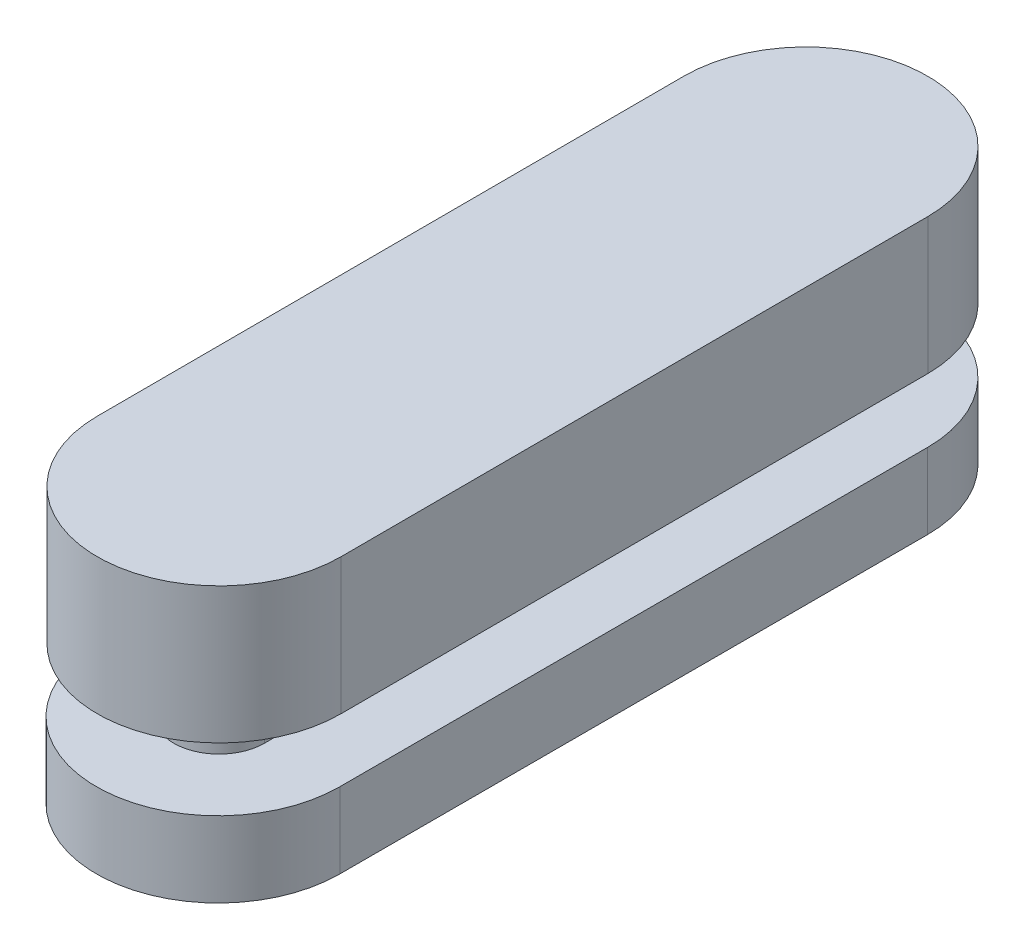
ISO-10303-21;
HEADER;
FILE_DESCRIPTION(('STEP AP214'),'2;1');
FILE_NAME('part.step','',(''),(''),'','','');
FILE_SCHEMA(('AUTOMOTIVE_DESIGN { 1 0 10303 214 1 1 1 1 }'));
ENDSEC;
DATA;
#1=APPLICATION_CONTEXT('core data for automotive mechanical design processes');
#2=APPLICATION_PROTOCOL_DEFINITION('international standard','automotive_design',2000,#1);
#3=PRODUCT_CONTEXT('',#1,'mechanical');
#4=PRODUCT('Part','Part','',(#3));
#5=PRODUCT_RELATED_PRODUCT_CATEGORY('part','',(#4));
#6=PRODUCT_DEFINITION_FORMATION('','',#4);
#7=PRODUCT_DEFINITION_CONTEXT('part definition',#1,'design');
#8=PRODUCT_DEFINITION('design','',#6,#7);
#9=PRODUCT_DEFINITION_SHAPE('','',#8);
#10=(LENGTH_UNIT() NAMED_UNIT(*) SI_UNIT(.MILLI.,.METRE.));
#11=(NAMED_UNIT(*) PLANE_ANGLE_UNIT() SI_UNIT($,.RADIAN.));
#12=(NAMED_UNIT(*) SI_UNIT($,.STERADIAN.) SOLID_ANGLE_UNIT());
#13=UNCERTAINTY_MEASURE_WITH_UNIT(LENGTH_MEASURE(1.E-05),#10,'distance_accuracy_value','');
#14=(GEOMETRIC_REPRESENTATION_CONTEXT(3) GLOBAL_UNCERTAINTY_ASSIGNED_CONTEXT((#13)) GLOBAL_UNIT_ASSIGNED_CONTEXT((#10,
#11,#12)) REPRESENTATION_CONTEXT('',''));
#15=CARTESIAN_POINT('',(0.,0.,0.));
#16=DIRECTION('',(0.,0.,1.));
#17=DIRECTION('',(1.,0.,0.));
#18=AXIS2_PLACEMENT_3D('',#15,#16,#17);
#19=CARTESIAN_POINT('',(0.,4.5,0.));
#20=DIRECTION('',(0.,-1.,0.));
#21=DIRECTION('',(0.,0.,-1.));
#22=AXIS2_PLACEMENT_3D('',#19,#20,#21);
#23=CYLINDRICAL_SURFACE('',#22,7.25);
#24=CARTESIAN_POINT('',(0.,0.,0.));
#25=DIRECTION('',(0.,1.,0.));
#26=DIRECTION('',(0.,0.,1.));
#27=AXIS2_PLACEMENT_3D('',#24,#25,#26);
#28=CIRCLE('',#27,7.25);
#29=CARTESIAN_POINT('',(7.25,0.,0.));
#30=VERTEX_POINT('',#29);
#31=CARTESIAN_POINT('',(-7.25,0.,0.));
#32=VERTEX_POINT('',#31);
#33=EDGE_CURVE('E181',#30,#32,#28,.T.);
#34=ORIENTED_EDGE('',*,*,#33,.T.);
#35=DIRECTION('',(0.,-1.,0.));
#36=VECTOR('',#35,1.);
#37=CARTESIAN_POINT('',(-7.25,4.5,0.));
#38=LINE('',#37,#36);
#39=CARTESIAN_POINT('',(-7.25,4.5,0.));
#40=VERTEX_POINT('',#39);
#41=EDGE_CURVE('E11',#40,#32,#38,.T.);
#42=ORIENTED_EDGE('',*,*,#41,.F.);
#43=CARTESIAN_POINT('',(0.,4.5,0.));
#44=DIRECTION('',(0.,1.,0.));
#45=DIRECTION('',(0.,0.,1.));
#46=AXIS2_PLACEMENT_3D('',#43,#44,#45);
#47=CIRCLE('',#46,7.25);
#48=CARTESIAN_POINT('',(7.25,4.5,0.));
#49=VERTEX_POINT('',#48);
#50=EDGE_CURVE('E182',#49,#40,#47,.T.);
#51=ORIENTED_EDGE('',*,*,#50,.F.);
#52=DIRECTION('',(0.,-1.,0.));
#53=VECTOR('',#52,1.);
#54=CARTESIAN_POINT('',(7.25,4.5,0.));
#55=LINE('',#54,#53);
#56=EDGE_CURVE('E192',#49,#30,#55,.T.);
#57=ORIENTED_EDGE('',*,*,#56,.T.);
#58=EDGE_LOOP('',(#34,#42,#51,#57));
#59=FACE_BOUND('',#58,.T.);
#60=ADVANCED_FACE('F37',(#59),#23,.T.);
#61=CARTESIAN_POINT('',(-7.25,4.5,0.));
#62=DIRECTION('',(1.,0.,0.));
#63=DIRECTION('',(0.,0.,-1.));
#64=AXIS2_PLACEMENT_3D('',#61,#62,#63);
#65=PLANE('',#64);
#66=DIRECTION('',(0.,0.,1.));
#67=VECTOR('',#66,1.);
#68=CARTESIAN_POINT('',(-7.25,0.,0.));
#69=LINE('',#68,#67);
#70=CARTESIAN_POINT('',(-7.24999999999999,0.,35.));
#71=VERTEX_POINT('',#70);
#72=EDGE_CURVE('E195',#32,#71,#69,.T.);
#73=ORIENTED_EDGE('',*,*,#72,.T.);
#74=DIRECTION('',(0.,-1.,0.));
#75=VECTOR('',#74,1.);
#76=CARTESIAN_POINT('',(-7.24999999999999,4.5,35.));
#77=LINE('',#76,#75);
#78=CARTESIAN_POINT('',(-7.24999999999999,4.5,35.));
#79=VERTEX_POINT('',#78);
#80=EDGE_CURVE('E44',#79,#71,#77,.T.);
#81=ORIENTED_EDGE('',*,*,#80,.F.);
#82=DIRECTION('',(0.,0.,1.));
#83=VECTOR('',#82,1.);
#84=CARTESIAN_POINT('',(-7.25,4.5,0.));
#85=LINE('',#84,#83);
#86=EDGE_CURVE('E185',#40,#79,#85,.T.);
#87=ORIENTED_EDGE('',*,*,#86,.F.);
#88=ORIENTED_EDGE('',*,*,#41,.T.);
#89=EDGE_LOOP('',(#73,#81,#87,#88));
#90=FACE_BOUND('',#89,.T.);
#91=ADVANCED_FACE('F225',(#90),#65,.F.);
#92=CARTESIAN_POINT('',(0.,4.5,35.));
#93=DIRECTION('',(0.,-1.,0.));
#94=DIRECTION('',(0.,0.,-1.));
#95=AXIS2_PLACEMENT_3D('',#92,#93,#94);
#96=CYLINDRICAL_SURFACE('',#95,7.25);
#97=CARTESIAN_POINT('',(0.,0.,35.));
#98=DIRECTION('',(0.,1.,0.));
#99=DIRECTION('',(0.,0.,1.));
#100=AXIS2_PLACEMENT_3D('',#97,#98,#99);
#101=CIRCLE('',#100,7.25);
#102=CARTESIAN_POINT('',(7.25,0.,35.));
#103=VERTEX_POINT('',#102);
#104=EDGE_CURVE('E197',#71,#103,#101,.T.);
#105=ORIENTED_EDGE('',*,*,#104,.T.);
#106=DIRECTION('',(0.,-1.,0.));
#107=VECTOR('',#106,1.);
#108=CARTESIAN_POINT('',(7.25,4.5,35.));
#109=LINE('',#108,#107);
#110=CARTESIAN_POINT('',(7.25,4.5,35.));
#111=VERTEX_POINT('',#110);
#112=EDGE_CURVE('E202',#111,#103,#109,.T.);
#113=ORIENTED_EDGE('',*,*,#112,.F.);
#114=CARTESIAN_POINT('',(0.,4.5,35.));
#115=DIRECTION('',(0.,1.,0.));
#116=DIRECTION('',(0.,0.,1.));
#117=AXIS2_PLACEMENT_3D('',#114,#115,#116);
#118=CIRCLE('',#117,7.25);
#119=EDGE_CURVE('E188',#79,#111,#118,.T.);
#120=ORIENTED_EDGE('',*,*,#119,.F.);
#121=ORIENTED_EDGE('',*,*,#80,.T.);
#122=EDGE_LOOP('',(#105,#113,#120,#121));
#123=FACE_BOUND('',#122,.T.);
#124=ADVANCED_FACE('F209',(#123),#96,.T.);
#125=CARTESIAN_POINT('',(7.25,4.5,0.));
#126=DIRECTION('',(-1.,0.,0.));
#127=DIRECTION('',(0.,0.,1.));
#128=AXIS2_PLACEMENT_3D('',#125,#126,#127);
#129=PLANE('',#128);
#130=DIRECTION('',(0.,0.,-1.));
#131=VECTOR('',#130,1.);
#132=CARTESIAN_POINT('',(7.25,0.,0.));
#133=LINE('',#132,#131);
#134=EDGE_CURVE('E186',#103,#30,#133,.T.);
#135=ORIENTED_EDGE('',*,*,#134,.T.);
#136=ORIENTED_EDGE('',*,*,#56,.F.);
#137=DIRECTION('',(0.,0.,-1.));
#138=VECTOR('',#137,1.);
#139=CARTESIAN_POINT('',(7.25,4.5,0.));
#140=LINE('',#139,#138);
#141=EDGE_CURVE('E190',#111,#49,#140,.T.);
#142=ORIENTED_EDGE('',*,*,#141,.F.);
#143=ORIENTED_EDGE('',*,*,#112,.T.);
#144=EDGE_LOOP('',(#135,#136,#142,#143));
#145=FACE_BOUND('',#144,.T.);
#146=ADVANCED_FACE('F218',(#145),#129,.F.);
#147=CARTESIAN_POINT('',(0.,4.5,0.));
#148=DIRECTION('',(0.,1.,0.));
#149=DIRECTION('',(0.,0.,1.));
#150=AXIS2_PLACEMENT_3D('',#147,#148,#149);
#151=PLANE('',#150);
#152=CARTESIAN_POINT('',(0.0706103890184494,4.5,0.0112960812225504));
#153=DIRECTION('',(0.,1.,0.));
#154=DIRECTION('',(0.,0.,1.));
#155=AXIS2_PLACEMENT_3D('',#152,#153,#154);
#156=CIRCLE('',#155,2.72992224514324);
#157=CARTESIAN_POINT('',(2.76379226914791,4.5,0.457666807267897));
#158=VERTEX_POINT('',#157);
#159=CARTESIAN_POINT('',(-2.62257149111101,4.5,0.457666807267911));
#160=VERTEX_POINT('',#159);
#161=EDGE_CURVE('E51',#158,#160,#156,.T.);
#162=ORIENTED_EDGE('',*,*,#161,.F.);
#163=DIRECTION('',(0.,0.,1.));
#164=VECTOR('',#163,1.);
#165=CARTESIAN_POINT('',(2.76379226914791,4.5,0.));
#166=LINE('',#165,#164);
#167=CARTESIAN_POINT('',(2.76379226914791,4.5,35.0112960812226));
#168=VERTEX_POINT('',#167);
#169=EDGE_CURVE('E56',#158,#168,#166,.T.);
#170=ORIENTED_EDGE('',*,*,#169,.T.);
#171=CARTESIAN_POINT('',(0.0706103890184538,4.5,35.0112960812226));
#172=DIRECTION('',(0.,1.,0.));
#173=DIRECTION('',(0.,0.,1.));
#174=AXIS2_PLACEMENT_3D('',#171,#172,#173);
#175=CIRCLE('',#174,2.69318188012946);
#176=CARTESIAN_POINT('',(-2.622571491111,4.5,35.0112960812226));
#177=VERTEX_POINT('',#176);
#178=EDGE_CURVE('E168',#177,#168,#175,.T.);
#179=ORIENTED_EDGE('',*,*,#178,.F.);
#180=DIRECTION('',(0.,0.,1.));
#181=VECTOR('',#180,1.);
#182=CARTESIAN_POINT('',(-2.62257149111101,4.5,0.));
#183=LINE('',#182,#181);
#184=EDGE_CURVE('E150',#160,#177,#183,.T.);
#185=ORIENTED_EDGE('',*,*,#184,.F.);
#186=EDGE_LOOP('',(#162,#170,#179,#185));
#187=FACE_BOUND('',#186,.T.);
#188=ORIENTED_EDGE('',*,*,#50,.T.);
#189=ORIENTED_EDGE('',*,*,#86,.T.);
#190=ORIENTED_EDGE('',*,*,#119,.T.);
#191=ORIENTED_EDGE('',*,*,#141,.T.);
#192=EDGE_LOOP('',(#188,#189,#190,#191));
#193=FACE_BOUND('',#192,.T.);
#194=ADVANCED_FACE('F224',(#187,#193),#151,.T.);
#195=CARTESIAN_POINT('',(0.,0.,0.));
#196=DIRECTION('',(0.,1.,0.));
#197=DIRECTION('',(0.,0.,1.));
#198=AXIS2_PLACEMENT_3D('',#195,#196,#197);
#199=PLANE('',#198);
#200=ORIENTED_EDGE('',*,*,#33,.F.);
#201=ORIENTED_EDGE('',*,*,#134,.F.);
#202=ORIENTED_EDGE('',*,*,#104,.F.);
#203=ORIENTED_EDGE('',*,*,#72,.F.);
#204=EDGE_LOOP('',(#200,#201,#202,#203));
#205=FACE_BOUND('',#204,.T.);
#206=ADVANCED_FACE('F215',(#205),#199,.F.);
#207=CARTESIAN_POINT('',(0.0706103890184494,8.3,0.0112960812225504));
#208=DIRECTION('',(0.,-1.,0.));
#209=DIRECTION('',(0.,0.,-1.));
#210=AXIS2_PLACEMENT_3D('',#207,#208,#209);
#211=CYLINDRICAL_SURFACE('',#210,2.72992224514324);
#212=ORIENTED_EDGE('',*,*,#161,.T.);
#213=DIRECTION('',(0.,-1.,0.));
#214=VECTOR('',#213,1.);
#215=CARTESIAN_POINT('',(-2.62257149111101,8.3,0.457666807267911));
#216=LINE('',#215,#214);
#217=CARTESIAN_POINT('',(-2.62257149111101,8.3,0.457666807267911));
#218=VERTEX_POINT('',#217);
#219=EDGE_CURVE('E178',#218,#160,#216,.T.);
#220=ORIENTED_EDGE('',*,*,#219,.F.);
#221=CARTESIAN_POINT('',(0.0706103890184494,8.3,0.0112960812225504));
#222=DIRECTION('',(0.,1.,0.));
#223=DIRECTION('',(0.,0.,1.));
#224=AXIS2_PLACEMENT_3D('',#221,#222,#223);
#225=CIRCLE('',#224,2.72992224514324);
#226=CARTESIAN_POINT('',(2.76379226914791,8.3,0.457666807267897));
#227=VERTEX_POINT('',#226);
#228=EDGE_CURVE('E156',#227,#218,#225,.T.);
#229=ORIENTED_EDGE('',*,*,#228,.F.);
#230=DIRECTION('',(0.,-1.,0.));
#231=VECTOR('',#230,1.);
#232=CARTESIAN_POINT('',(2.76379226914791,8.3,0.457666807267897));
#233=LINE('',#232,#231);
#234=EDGE_CURVE('E164',#227,#158,#233,.T.);
#235=ORIENTED_EDGE('',*,*,#234,.T.);
#236=EDGE_LOOP('',(#212,#220,#229,#235));
#237=FACE_BOUND('',#236,.T.);
#238=ADVANCED_FACE('F237',(#237),#211,.T.);
#239=CARTESIAN_POINT('',(-2.62257149111101,8.3,0.));
#240=DIRECTION('',(1.,0.,0.));
#241=DIRECTION('',(0.,0.,-1.));
#242=AXIS2_PLACEMENT_3D('',#239,#240,#241);
#243=PLANE('',#242);
#244=ORIENTED_EDGE('',*,*,#184,.T.);
#245=DIRECTION('',(0.,-1.,0.));
#246=VECTOR('',#245,1.);
#247=CARTESIAN_POINT('',(-2.622571491111,8.3,35.0112960812226));
#248=LINE('',#247,#246);
#249=CARTESIAN_POINT('',(-2.622571491111,8.3,35.0112960812226));
#250=VERTEX_POINT('',#249);
#251=EDGE_CURVE('E175',#250,#177,#248,.T.);
#252=ORIENTED_EDGE('',*,*,#251,.F.);
#253=DIRECTION('',(0.,0.,1.));
#254=VECTOR('',#253,1.);
#255=CARTESIAN_POINT('',(-2.62257149111101,8.3,0.));
#256=LINE('',#255,#254);
#257=EDGE_CURVE('E158',#218,#250,#256,.T.);
#258=ORIENTED_EDGE('',*,*,#257,.F.);
#259=ORIENTED_EDGE('',*,*,#219,.T.);
#260=EDGE_LOOP('',(#244,#252,#258,#259));
#261=FACE_BOUND('',#260,.T.);
#262=ADVANCED_FACE('F242',(#261),#243,.F.);
#263=CARTESIAN_POINT('',(0.0706103890184538,8.3,35.0112960812226));
#264=DIRECTION('',(0.,-1.,0.));
#265=DIRECTION('',(0.,0.,-1.));
#266=AXIS2_PLACEMENT_3D('',#263,#264,#265);
#267=CYLINDRICAL_SURFACE('',#266,2.69318188012946);
#268=ORIENTED_EDGE('',*,*,#178,.T.);
#269=DIRECTION('',(0.,-1.,0.));
#270=VECTOR('',#269,1.);
#271=CARTESIAN_POINT('',(2.76379226914791,8.3,35.0112960812226));
#272=LINE('',#271,#270);
#273=CARTESIAN_POINT('',(2.76379226914791,8.3,35.0112960812226));
#274=VERTEX_POINT('',#273);
#275=EDGE_CURVE('E173',#274,#168,#272,.T.);
#276=ORIENTED_EDGE('',*,*,#275,.F.);
#277=CARTESIAN_POINT('',(0.0706103890184538,8.3,35.0112960812226));
#278=DIRECTION('',(0.,1.,0.));
#279=DIRECTION('',(0.,0.,1.));
#280=AXIS2_PLACEMENT_3D('',#277,#278,#279);
#281=CIRCLE('',#280,2.69318188012946);
#282=EDGE_CURVE('E160',#250,#274,#281,.T.);
#283=ORIENTED_EDGE('',*,*,#282,.F.);
#284=ORIENTED_EDGE('',*,*,#251,.T.);
#285=EDGE_LOOP('',(#268,#276,#283,#284));
#286=FACE_BOUND('',#285,.T.);
#287=ADVANCED_FACE('F246',(#286),#267,.T.);
#288=CARTESIAN_POINT('',(2.76379226914791,8.3,0.));
#289=DIRECTION('',(1.,0.,0.));
#290=DIRECTION('',(0.,0.,-1.));
#291=AXIS2_PLACEMENT_3D('',#288,#289,#290);
#292=PLANE('',#291);
#293=ORIENTED_EDGE('',*,*,#169,.F.);
#294=ORIENTED_EDGE('',*,*,#234,.F.);
#295=DIRECTION('',(0.,0.,1.));
#296=VECTOR('',#295,1.);
#297=CARTESIAN_POINT('',(2.76379226914791,8.3,0.));
#298=LINE('',#297,#296);
#299=EDGE_CURVE('E162',#227,#274,#298,.T.);
#300=ORIENTED_EDGE('',*,*,#299,.T.);
#301=ORIENTED_EDGE('',*,*,#275,.T.);
#302=EDGE_LOOP('',(#293,#294,#300,#301));
#303=FACE_BOUND('',#302,.T.);
#304=ADVANCED_FACE('F250',(#303),#292,.T.);
#305=CARTESIAN_POINT('',(0.,8.3,0.));
#306=DIRECTION('',(0.,1.,0.));
#307=DIRECTION('',(0.,0.,1.));
#308=AXIS2_PLACEMENT_3D('',#305,#306,#307);
#309=PLANE('',#308);
#310=CARTESIAN_POINT('',(0.,8.3,0.));
#311=DIRECTION('',(0.,1.,0.));
#312=DIRECTION('',(0.,0.,1.));
#313=AXIS2_PLACEMENT_3D('',#310,#311,#312);
#314=CIRCLE('',#313,7.25309616093368);
#315=CARTESIAN_POINT('',(7.25308141022293,8.3,-0.0146279331896265));
#316=VERTEX_POINT('',#315);
#317=CARTESIAN_POINT('',(-7.25308141022293,8.3,0.0146279331896265));
#318=VERTEX_POINT('',#317);
#319=EDGE_CURVE('E148',#316,#318,#314,.T.);
#320=ORIENTED_EDGE('',*,*,#319,.F.);
#321=DIRECTION('',(-0.0020167846758209,0.,-0.999997966287718));
#322=VECTOR('',#321,1.);
#323=CARTESIAN_POINT('',(7.25308141022293,8.3,-0.0146279331896265));
#324=LINE('',#323,#322);
#325=CARTESIAN_POINT('',(7.32369179924138,8.3,34.9966681480329));
#326=VERTEX_POINT('',#325);
#327=EDGE_CURVE('E144',#326,#316,#324,.T.);
#328=ORIENTED_EDGE('',*,*,#327,.F.);
#329=CARTESIAN_POINT('',(0.0706103890184538,8.3,35.0112960812226));
#330=DIRECTION('',(0.,1.,0.));
#331=DIRECTION('',(0.,0.,1.));
#332=AXIS2_PLACEMENT_3D('',#329,#330,#331);
#333=CIRCLE('',#332,7.25309616093368);
#334=CARTESIAN_POINT('',(-7.18247102120448,8.3,35.0259240144122));
#335=VERTEX_POINT('',#334);
#336=EDGE_CURVE('E378',#335,#326,#333,.T.);
#337=ORIENTED_EDGE('',*,*,#336,.F.);
#338=DIRECTION('',(0.0020167846758209,0.,0.999997966287718));
#339=VECTOR('',#338,1.);
#340=CARTESIAN_POINT('',(-7.25308141022293,8.3,0.0146279331896265));
#341=LINE('',#340,#339);
#342=EDGE_CURVE('E376',#318,#335,#341,.T.);
#343=ORIENTED_EDGE('',*,*,#342,.F.);
#344=EDGE_LOOP('',(#320,#328,#337,#343));
#345=FACE_BOUND('',#344,.T.);
#346=ORIENTED_EDGE('',*,*,#299,.F.);
#347=ORIENTED_EDGE('',*,*,#228,.T.);
#348=ORIENTED_EDGE('',*,*,#257,.T.);
#349=ORIENTED_EDGE('',*,*,#282,.T.);
#350=EDGE_LOOP('',(#346,#347,#348,#349));
#351=FACE_BOUND('',#350,.T.);
#352=ADVANCED_FACE('F254',(#345,#351),#309,.F.);
#353=CARTESIAN_POINT('',(0.,16.4,0.));
#354=DIRECTION('',(0.,-1.,0.));
#355=DIRECTION('',(0.,0.,-1.));
#356=AXIS2_PLACEMENT_3D('',#353,#354,#355);
#357=CYLINDRICAL_SURFACE('',#356,7.25309616093368);
#358=ORIENTED_EDGE('',*,*,#319,.T.);
#359=DIRECTION('',(0.,-1.,0.));
#360=VECTOR('',#359,1.);
#361=CARTESIAN_POINT('',(-7.25308141022293,16.4,0.0146279331896265));
#362=LINE('',#361,#360);
#363=CARTESIAN_POINT('',(-7.25308141022293,16.4,0.0146279331896265));
#364=VERTEX_POINT('',#363);
#365=EDGE_CURVE('E128',#364,#318,#362,.T.);
#366=ORIENTED_EDGE('',*,*,#365,.F.);
#367=CARTESIAN_POINT('',(0.,16.4,0.));
#368=DIRECTION('',(0.,1.,0.));
#369=DIRECTION('',(0.,0.,1.));
#370=AXIS2_PLACEMENT_3D('',#367,#368,#369);
#371=CIRCLE('',#370,7.25309616093368);
#372=CARTESIAN_POINT('',(7.25308141022293,16.4,-0.0146279331896265));
#373=VERTEX_POINT('',#372);
#374=EDGE_CURVE('E135',#373,#364,#371,.T.);
#375=ORIENTED_EDGE('',*,*,#374,.F.);
#376=DIRECTION('',(0.,-1.,0.));
#377=VECTOR('',#376,1.);
#378=CARTESIAN_POINT('',(7.25308141022293,16.4,-0.0146279331896265));
#379=LINE('',#378,#377);
#380=EDGE_CURVE('E385',#373,#316,#379,.T.);
#381=ORIENTED_EDGE('',*,*,#380,.T.);
#382=EDGE_LOOP('',(#358,#366,#375,#381));
#383=FACE_BOUND('',#382,.T.);
#384=ADVANCED_FACE('F146',(#383),#357,.T.);
#385=CARTESIAN_POINT('',(-7.25308141022293,16.4,0.0146279331896265));
#386=DIRECTION('',(0.999997966287718,0.,-0.0020167846758209));
#387=DIRECTION('',(-0.0020167846758209,0.,-0.999997966287718));
#388=AXIS2_PLACEMENT_3D('',#385,#386,#387);
#389=PLANE('',#388);
#390=ORIENTED_EDGE('',*,*,#342,.T.);
#391=DIRECTION('',(0.,-1.,0.));
#392=VECTOR('',#391,1.);
#393=CARTESIAN_POINT('',(-7.18247102120448,16.4,35.0259240144122));
#394=LINE('',#393,#392);
#395=CARTESIAN_POINT('',(-7.18247102120448,16.4,35.0259240144122));
#396=VERTEX_POINT('',#395);
#397=EDGE_CURVE('E131',#396,#335,#394,.T.);
#398=ORIENTED_EDGE('',*,*,#397,.F.);
#399=DIRECTION('',(0.0020167846758209,0.,0.999997966287718));
#400=VECTOR('',#399,1.);
#401=CARTESIAN_POINT('',(-7.25308141022293,16.4,0.0146279331896265));
#402=LINE('',#401,#400);
#403=EDGE_CURVE('E124',#364,#396,#402,.T.);
#404=ORIENTED_EDGE('',*,*,#403,.F.);
#405=ORIENTED_EDGE('',*,*,#365,.T.);
#406=EDGE_LOOP('',(#390,#398,#404,#405));
#407=FACE_BOUND('',#406,.T.);
#408=ADVANCED_FACE('F126',(#407),#389,.F.);
#409=CARTESIAN_POINT('',(0.0706103890184538,16.4,35.0112960812226));
#410=DIRECTION('',(0.,-1.,0.));
#411=DIRECTION('',(0.,0.,-1.));
#412=AXIS2_PLACEMENT_3D('',#409,#410,#411);
#413=CYLINDRICAL_SURFACE('',#412,7.25309616093368);
#414=ORIENTED_EDGE('',*,*,#336,.T.);
#415=DIRECTION('',(0.,-1.,0.));
#416=VECTOR('',#415,1.);
#417=CARTESIAN_POINT('',(7.32369179924138,16.4,34.9966681480329));
#418=LINE('',#417,#416);
#419=CARTESIAN_POINT('',(7.32369179924138,16.4,34.9966681480329));
#420=VERTEX_POINT('',#419);
#421=EDGE_CURVE('E152',#420,#326,#418,.T.);
#422=ORIENTED_EDGE('',*,*,#421,.F.);
#423=CARTESIAN_POINT('',(0.0706103890184538,16.4,35.0112960812226));
#424=DIRECTION('',(0.,1.,0.));
#425=DIRECTION('',(0.,0.,1.));
#426=AXIS2_PLACEMENT_3D('',#423,#424,#425);
#427=CIRCLE('',#426,7.25309616093368);
#428=EDGE_CURVE('E134',#396,#420,#427,.T.);
#429=ORIENTED_EDGE('',*,*,#428,.F.);
#430=ORIENTED_EDGE('',*,*,#397,.T.);
#431=EDGE_LOOP('',(#414,#422,#429,#430));
#432=FACE_BOUND('',#431,.T.);
#433=ADVANCED_FACE('F260',(#432),#413,.T.);
#434=CARTESIAN_POINT('',(7.25308141022293,16.4,-0.0146279331896265));
#435=DIRECTION('',(-0.999997966287718,0.,0.0020167846758209));
#436=DIRECTION('',(0.0020167846758209,0.,0.999997966287718));
#437=AXIS2_PLACEMENT_3D('',#434,#435,#436);
#438=PLANE('',#437);
#439=ORIENTED_EDGE('',*,*,#327,.T.);
#440=ORIENTED_EDGE('',*,*,#380,.F.);
#441=DIRECTION('',(-0.0020167846758209,0.,-0.999997966287718));
#442=VECTOR('',#441,1.);
#443=CARTESIAN_POINT('',(7.25308141022293,16.4,-0.0146279331896265));
#444=LINE('',#443,#442);
#445=EDGE_CURVE('E140',#420,#373,#444,.T.);
#446=ORIENTED_EDGE('',*,*,#445,.F.);
#447=ORIENTED_EDGE('',*,*,#421,.T.);
#448=EDGE_LOOP('',(#439,#440,#446,#447));
#449=FACE_BOUND('',#448,.T.);
#450=ADVANCED_FACE('F263',(#449),#438,.F.);
#451=CARTESIAN_POINT('',(0.,16.4,0.));
#452=DIRECTION('',(0.,1.,0.));
#453=DIRECTION('',(0.,0.,1.));
#454=AXIS2_PLACEMENT_3D('',#451,#452,#453);
#455=PLANE('',#454);
#456=ORIENTED_EDGE('',*,*,#374,.T.);
#457=ORIENTED_EDGE('',*,*,#403,.T.);
#458=ORIENTED_EDGE('',*,*,#428,.T.);
#459=ORIENTED_EDGE('',*,*,#445,.T.);
#460=EDGE_LOOP('',(#456,#457,#458,#459));
#461=FACE_BOUND('',#460,.T.);
#462=ADVANCED_FACE('F138',(#461),#455,.T.);
#463=CLOSED_SHELL('',(#60,#91,#124,#146,#194,#206,#238,#262,#287,#304,#352,#384,#408,#433,#450,#462));
#464=MANIFOLD_SOLID_BREP('B2',#463);
#465=ADVANCED_BREP_SHAPE_REPRESENTATION('',(#18,#464),#14);
#466=SHAPE_DEFINITION_REPRESENTATION(#9,#465);
ENDSEC;
END-ISO-10303-21;
